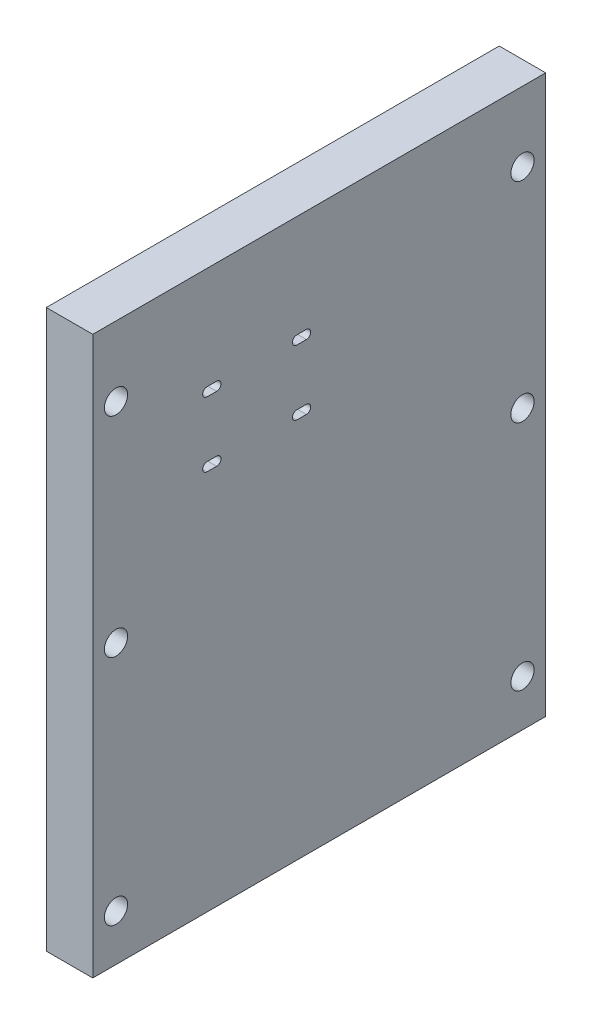
ISO-10303-21;
HEADER;
FILE_DESCRIPTION(('STEP AP214'),'2;1');
FILE_NAME('part.step','',(''),(''),'','','');
FILE_SCHEMA(('AUTOMOTIVE_DESIGN { 1 0 10303 214 1 1 1 1 }'));
ENDSEC;
DATA;
#1=APPLICATION_CONTEXT('core data for automotive mechanical design processes');
#2=APPLICATION_PROTOCOL_DEFINITION('international standard','automotive_design',2000,#1);
#3=PRODUCT_CONTEXT('',#1,'mechanical');
#4=PRODUCT('Part','Part','',(#3));
#5=PRODUCT_RELATED_PRODUCT_CATEGORY('part','',(#4));
#6=PRODUCT_DEFINITION_FORMATION('','',#4);
#7=PRODUCT_DEFINITION_CONTEXT('part definition',#1,'design');
#8=PRODUCT_DEFINITION('design','',#6,#7);
#9=PRODUCT_DEFINITION_SHAPE('','',#8);
#10=(LENGTH_UNIT() NAMED_UNIT(*) SI_UNIT(.MILLI.,.METRE.));
#11=(NAMED_UNIT(*) PLANE_ANGLE_UNIT() SI_UNIT($,.RADIAN.));
#12=(NAMED_UNIT(*) SI_UNIT($,.STERADIAN.) SOLID_ANGLE_UNIT());
#13=UNCERTAINTY_MEASURE_WITH_UNIT(LENGTH_MEASURE(1.E-05),#10,'distance_accuracy_value','');
#14=(GEOMETRIC_REPRESENTATION_CONTEXT(3) GLOBAL_UNCERTAINTY_ASSIGNED_CONTEXT((#13)) GLOBAL_UNIT_ASSIGNED_CONTEXT((#10,
#11,#12)) REPRESENTATION_CONTEXT('',''));
#15=CARTESIAN_POINT('',(0.,0.,0.));
#16=DIRECTION('',(0.,0.,1.));
#17=DIRECTION('',(1.,0.,0.));
#18=AXIS2_PLACEMENT_3D('',#15,#16,#17);
#19=CARTESIAN_POINT('',(12.7,46.97,-33.570324851537));
#20=DIRECTION('',(-1.,0.,0.));
#21=DIRECTION('',(0.,0.,1.));
#22=AXIS2_PLACEMENT_3D('',#19,#20,#21);
#23=CYLINDRICAL_SURFACE('',#22,1.2);
#24=CARTESIAN_POINT('',(0.,46.97,-33.570324851537));
#25=DIRECTION('',(1.,0.,0.));
#26=DIRECTION('',(0.,0.,-1.));
#27=AXIS2_PLACEMENT_3D('',#24,#25,#26);
#28=CIRCLE('',#27,1.2);
#29=CARTESIAN_POINT('',(0.,48.17,-33.570324851537));
#30=VERTEX_POINT('',#29);
#31=CARTESIAN_POINT('',(0.,45.77,-33.570324851537));
#32=VERTEX_POINT('',#31);
#33=EDGE_CURVE('E348',#30,#32,#28,.T.);
#34=ORIENTED_EDGE('',*,*,#33,.F.);
#35=DIRECTION('',(-1.,0.,0.));
#36=VECTOR('',#35,1.);
#37=CARTESIAN_POINT('',(12.7,48.17,-33.570324851537));
#38=LINE('',#37,#36);
#39=CARTESIAN_POINT('',(12.7,48.17,-33.570324851537));
#40=VERTEX_POINT('',#39);
#41=EDGE_CURVE('E11',#40,#30,#38,.T.);
#42=ORIENTED_EDGE('',*,*,#41,.F.);
#43=CARTESIAN_POINT('',(12.7,46.97,-33.570324851537));
#44=DIRECTION('',(1.,0.,0.));
#45=DIRECTION('',(0.,0.,-1.));
#46=AXIS2_PLACEMENT_3D('',#43,#44,#45);
#47=CIRCLE('',#46,1.2);
#48=CARTESIAN_POINT('',(12.7,45.77,-33.570324851537));
#49=VERTEX_POINT('',#48);
#50=EDGE_CURVE('E251',#40,#49,#47,.T.);
#51=ORIENTED_EDGE('',*,*,#50,.T.);
#52=DIRECTION('',(-1.,0.,0.));
#53=VECTOR('',#52,1.);
#54=CARTESIAN_POINT('',(12.7,45.77,-33.570324851537));
#55=LINE('',#54,#53);
#56=EDGE_CURVE('E161',#49,#32,#55,.T.);
#57=ORIENTED_EDGE('',*,*,#56,.T.);
#58=EDGE_LOOP('',(#34,#42,#51,#57));
#59=FACE_BOUND('',#58,.T.);
#60=ADVANCED_FACE('F51',(#59),#23,.F.);
#61=CARTESIAN_POINT('',(12.7,48.17,0.));
#62=DIRECTION('',(0.,-1.,0.));
#63=DIRECTION('',(0.,0.,-1.));
#64=AXIS2_PLACEMENT_3D('',#61,#62,#63);
#65=PLANE('',#64);
#66=DIRECTION('',(0.,0.,1.));
#67=VECTOR('',#66,1.);
#68=CARTESIAN_POINT('',(0.,48.17,0.));
#69=LINE('',#68,#67);
#70=CARTESIAN_POINT('',(0.,48.17,-36.170324851537));
#71=VERTEX_POINT('',#70);
#72=EDGE_CURVE('E242',#71,#30,#69,.T.);
#73=ORIENTED_EDGE('',*,*,#72,.F.);
#74=DIRECTION('',(-1.,0.,0.));
#75=VECTOR('',#74,1.);
#76=CARTESIAN_POINT('',(12.7,48.17,-36.170324851537));
#77=LINE('',#76,#75);
#78=CARTESIAN_POINT('',(12.7,48.17,-36.170324851537));
#79=VERTEX_POINT('',#78);
#80=EDGE_CURVE('E62',#79,#71,#77,.T.);
#81=ORIENTED_EDGE('',*,*,#80,.F.);
#82=DIRECTION('',(0.,0.,1.));
#83=VECTOR('',#82,1.);
#84=CARTESIAN_POINT('',(12.7,48.17,0.));
#85=LINE('',#84,#83);
#86=EDGE_CURVE('E240',#79,#40,#85,.T.);
#87=ORIENTED_EDGE('',*,*,#86,.T.);
#88=ORIENTED_EDGE('',*,*,#41,.T.);
#89=EDGE_LOOP('',(#73,#81,#87,#88));
#90=FACE_BOUND('',#89,.T.);
#91=ADVANCED_FACE('F239',(#90),#65,.T.);
#92=CARTESIAN_POINT('',(12.7,46.97,-36.170324851537));
#93=DIRECTION('',(-1.,0.,0.));
#94=DIRECTION('',(0.,0.,1.));
#95=AXIS2_PLACEMENT_3D('',#92,#93,#94);
#96=CYLINDRICAL_SURFACE('',#95,1.2);
#97=CARTESIAN_POINT('',(0.,46.97,-36.170324851537));
#98=DIRECTION('',(1.,0.,0.));
#99=DIRECTION('',(0.,0.,-1.));
#100=AXIS2_PLACEMENT_3D('',#97,#98,#99);
#101=CIRCLE('',#100,1.2);
#102=CARTESIAN_POINT('',(0.,45.77,-36.170324851537));
#103=VERTEX_POINT('',#102);
#104=EDGE_CURVE('E354',#103,#71,#101,.T.);
#105=ORIENTED_EDGE('',*,*,#104,.F.);
#106=DIRECTION('',(-1.,0.,0.));
#107=VECTOR('',#106,1.);
#108=CARTESIAN_POINT('',(12.7,45.77,-36.170324851537));
#109=LINE('',#108,#107);
#110=CARTESIAN_POINT('',(12.7,45.77,-36.170324851537));
#111=VERTEX_POINT('',#110);
#112=EDGE_CURVE('E154',#111,#103,#109,.T.);
#113=ORIENTED_EDGE('',*,*,#112,.F.);
#114=CARTESIAN_POINT('',(12.7,46.97,-36.170324851537));
#115=DIRECTION('',(1.,0.,0.));
#116=DIRECTION('',(0.,0.,-1.));
#117=AXIS2_PLACEMENT_3D('',#114,#115,#116);
#118=CIRCLE('',#117,1.2);
#119=EDGE_CURVE('E250',#111,#79,#118,.T.);
#120=ORIENTED_EDGE('',*,*,#119,.T.);
#121=ORIENTED_EDGE('',*,*,#80,.T.);
#122=EDGE_LOOP('',(#105,#113,#120,#121));
#123=FACE_BOUND('',#122,.T.);
#124=ADVANCED_FACE('F254',(#123),#96,.F.);
#125=CARTESIAN_POINT('',(12.7,30.43,0.));
#126=DIRECTION('',(0.,-1.,0.));
#127=DIRECTION('',(0.,0.,-1.));
#128=AXIS2_PLACEMENT_3D('',#125,#126,#127);
#129=PLANE('',#128);
#130=DIRECTION('',(0.,0.,1.));
#131=VECTOR('',#130,1.);
#132=CARTESIAN_POINT('',(0.,30.43,0.));
#133=LINE('',#132,#131);
#134=CARTESIAN_POINT('',(0.,30.43,-36.170324851537));
#135=VERTEX_POINT('',#134);
#136=CARTESIAN_POINT('',(0.,30.43,-33.570324851537));
#137=VERTEX_POINT('',#136);
#138=EDGE_CURVE('E332',#135,#137,#133,.T.);
#139=ORIENTED_EDGE('',*,*,#138,.F.);
#140=DIRECTION('',(-1.,0.,0.));
#141=VECTOR('',#140,1.);
#142=CARTESIAN_POINT('',(12.7,30.43,-36.170324851537));
#143=LINE('',#142,#141);
#144=CARTESIAN_POINT('',(12.7,30.43,-36.170324851537));
#145=VERTEX_POINT('',#144);
#146=EDGE_CURVE('E363',#145,#135,#143,.T.);
#147=ORIENTED_EDGE('',*,*,#146,.F.);
#148=DIRECTION('',(0.,0.,1.));
#149=VECTOR('',#148,1.);
#150=CARTESIAN_POINT('',(12.7,30.43,0.));
#151=LINE('',#150,#149);
#152=CARTESIAN_POINT('',(12.7,30.43,-33.570324851537));
#153=VERTEX_POINT('',#152);
#154=EDGE_CURVE('E473',#145,#153,#151,.T.);
#155=ORIENTED_EDGE('',*,*,#154,.T.);
#156=DIRECTION('',(-1.,0.,0.));
#157=VECTOR('',#156,1.);
#158=CARTESIAN_POINT('',(12.7,30.43,-33.570324851537));
#159=LINE('',#158,#157);
#160=EDGE_CURVE('E366',#153,#137,#159,.T.);
#161=ORIENTED_EDGE('',*,*,#160,.T.);
#162=EDGE_LOOP('',(#139,#147,#155,#161));
#163=FACE_BOUND('',#162,.T.);
#164=ADVANCED_FACE('F522',(#163),#129,.T.);
#165=CARTESIAN_POINT('',(12.7,29.23,-36.170324851537));
#166=DIRECTION('',(-1.,0.,0.));
#167=DIRECTION('',(0.,0.,1.));
#168=AXIS2_PLACEMENT_3D('',#165,#166,#167);
#169=CYLINDRICAL_SURFACE('',#168,1.2);
#170=CARTESIAN_POINT('',(0.,29.23,-36.170324851537));
#171=DIRECTION('',(1.,0.,0.));
#172=DIRECTION('',(0.,0.,-1.));
#173=AXIS2_PLACEMENT_3D('',#170,#171,#172);
#174=CIRCLE('',#173,1.2);
#175=CARTESIAN_POINT('',(0.,28.03,-36.170324851537));
#176=VERTEX_POINT('',#175);
#177=EDGE_CURVE('E336',#135,#176,#174,.F.);
#178=ORIENTED_EDGE('',*,*,#177,.T.);
#179=DIRECTION('',(-1.,0.,0.));
#180=VECTOR('',#179,1.);
#181=CARTESIAN_POINT('',(12.7,28.03,-36.170324851537));
#182=LINE('',#181,#180);
#183=CARTESIAN_POINT('',(12.7,28.03,-36.170324851537));
#184=VERTEX_POINT('',#183);
#185=EDGE_CURVE('E374',#184,#176,#182,.T.);
#186=ORIENTED_EDGE('',*,*,#185,.F.);
#187=CARTESIAN_POINT('',(12.7,29.23,-36.170324851537));
#188=DIRECTION('',(1.,0.,0.));
#189=DIRECTION('',(0.,0.,-1.));
#190=AXIS2_PLACEMENT_3D('',#187,#188,#189);
#191=CIRCLE('',#190,1.2);
#192=EDGE_CURVE('E477',#145,#184,#191,.F.);
#193=ORIENTED_EDGE('',*,*,#192,.F.);
#194=ORIENTED_EDGE('',*,*,#146,.T.);
#195=EDGE_LOOP('',(#178,#186,#193,#194));
#196=FACE_BOUND('',#195,.T.);
#197=ADVANCED_FACE('F518',(#196),#169,.F.);
#198=CARTESIAN_POINT('',(12.7,28.03,0.));
#199=DIRECTION('',(0.,-1.,0.));
#200=DIRECTION('',(0.,0.,-1.));
#201=AXIS2_PLACEMENT_3D('',#198,#199,#200);
#202=PLANE('',#201);
#203=DIRECTION('',(0.,0.,1.));
#204=VECTOR('',#203,1.);
#205=CARTESIAN_POINT('',(0.,28.03,0.));
#206=LINE('',#205,#204);
#207=CARTESIAN_POINT('',(0.,28.03,-33.570324851537));
#208=VERTEX_POINT('',#207);
#209=EDGE_CURVE('E340',#176,#208,#206,.T.);
#210=ORIENTED_EDGE('',*,*,#209,.T.);
#211=DIRECTION('',(-1.,0.,0.));
#212=VECTOR('',#211,1.);
#213=CARTESIAN_POINT('',(12.7,28.03,-33.570324851537));
#214=LINE('',#213,#212);
#215=CARTESIAN_POINT('',(12.7,28.03,-33.570324851537));
#216=VERTEX_POINT('',#215);
#217=EDGE_CURVE('E369',#216,#208,#214,.T.);
#218=ORIENTED_EDGE('',*,*,#217,.F.);
#219=DIRECTION('',(0.,0.,1.));
#220=VECTOR('',#219,1.);
#221=CARTESIAN_POINT('',(12.7,28.03,0.));
#222=LINE('',#221,#220);
#223=EDGE_CURVE('E481',#184,#216,#222,.T.);
#224=ORIENTED_EDGE('',*,*,#223,.F.);
#225=ORIENTED_EDGE('',*,*,#185,.T.);
#226=EDGE_LOOP('',(#210,#218,#224,#225));
#227=FACE_BOUND('',#226,.T.);
#228=ADVANCED_FACE('F514',(#227),#202,.F.);
#229=CARTESIAN_POINT('',(12.7,45.77,0.));
#230=DIRECTION('',(0.,1.,0.));
#231=DIRECTION('',(0.,0.,1.));
#232=AXIS2_PLACEMENT_3D('',#229,#230,#231);
#233=PLANE('',#232);
#234=DIRECTION('',(0.,0.,-1.));
#235=VECTOR('',#234,1.);
#236=CARTESIAN_POINT('',(0.,45.77,0.));
#237=LINE('',#236,#235);
#238=CARTESIAN_POINT('',(0.,45.77,-9.03032485153705));
#239=VERTEX_POINT('',#238);
#240=CARTESIAN_POINT('',(0.,45.77,-11.6303248515371));
#241=VERTEX_POINT('',#240);
#242=EDGE_CURVE('E316',#239,#241,#237,.T.);
#243=ORIENTED_EDGE('',*,*,#242,.F.);
#244=DIRECTION('',(-1.,0.,0.));
#245=VECTOR('',#244,1.);
#246=CARTESIAN_POINT('',(12.7,45.77,-9.03032485153705));
#247=LINE('',#246,#245);
#248=CARTESIAN_POINT('',(12.7,45.77,-9.03032485153705));
#249=VERTEX_POINT('',#248);
#250=EDGE_CURVE('E370',#249,#239,#247,.T.);
#251=ORIENTED_EDGE('',*,*,#250,.F.);
#252=DIRECTION('',(0.,0.,-1.));
#253=VECTOR('',#252,1.);
#254=CARTESIAN_POINT('',(12.7,45.77,0.));
#255=LINE('',#254,#253);
#256=CARTESIAN_POINT('',(12.7,45.77,-11.6303248515371));
#257=VERTEX_POINT('',#256);
#258=EDGE_CURVE('E458',#249,#257,#255,.T.);
#259=ORIENTED_EDGE('',*,*,#258,.T.);
#260=DIRECTION('',(-1.,0.,0.));
#261=VECTOR('',#260,1.);
#262=CARTESIAN_POINT('',(12.7,45.77,-11.6303248515371));
#263=LINE('',#262,#261);
#264=EDGE_CURVE('E380',#257,#241,#263,.T.);
#265=ORIENTED_EDGE('',*,*,#264,.T.);
#266=EDGE_LOOP('',(#243,#251,#259,#265));
#267=FACE_BOUND('',#266,.T.);
#268=ADVANCED_FACE('F517',(#267),#233,.T.);
#269=CARTESIAN_POINT('',(12.7,46.97,-9.03032485153705));
#270=DIRECTION('',(-1.,0.,0.));
#271=DIRECTION('',(0.,0.,1.));
#272=AXIS2_PLACEMENT_3D('',#269,#270,#271);
#273=CYLINDRICAL_SURFACE('',#272,1.2);
#274=CARTESIAN_POINT('',(0.,46.97,-9.03032485153705));
#275=DIRECTION('',(1.,0.,0.));
#276=DIRECTION('',(0.,0.,-1.));
#277=AXIS2_PLACEMENT_3D('',#274,#275,#276);
#278=CIRCLE('',#277,1.2);
#279=CARTESIAN_POINT('',(0.,48.17,-9.03032485153705));
#280=VERTEX_POINT('',#279);
#281=EDGE_CURVE('E320',#239,#280,#278,.F.);
#282=ORIENTED_EDGE('',*,*,#281,.T.);
#283=DIRECTION('',(-1.,0.,0.));
#284=VECTOR('',#283,1.);
#285=CARTESIAN_POINT('',(12.7,48.17,-9.03032485153705));
#286=LINE('',#285,#284);
#287=CARTESIAN_POINT('',(12.7,48.17,-9.03032485153705));
#288=VERTEX_POINT('',#287);
#289=EDGE_CURVE('E388',#288,#280,#286,.T.);
#290=ORIENTED_EDGE('',*,*,#289,.F.);
#291=CARTESIAN_POINT('',(12.7,46.97,-9.03032485153705));
#292=DIRECTION('',(1.,0.,0.));
#293=DIRECTION('',(0.,0.,-1.));
#294=AXIS2_PLACEMENT_3D('',#291,#292,#293);
#295=CIRCLE('',#294,1.2);
#296=EDGE_CURVE('E462',#249,#288,#295,.F.);
#297=ORIENTED_EDGE('',*,*,#296,.F.);
#298=ORIENTED_EDGE('',*,*,#250,.T.);
#299=EDGE_LOOP('',(#282,#290,#297,#298));
#300=FACE_BOUND('',#299,.T.);
#301=ADVANCED_FACE('F534',(#300),#273,.F.);
#302=CARTESIAN_POINT('',(12.7,48.17,0.));
#303=DIRECTION('',(0.,1.,0.));
#304=DIRECTION('',(0.,0.,1.));
#305=AXIS2_PLACEMENT_3D('',#302,#303,#304);
#306=PLANE('',#305);
#307=DIRECTION('',(0.,0.,-1.));
#308=VECTOR('',#307,1.);
#309=CARTESIAN_POINT('',(0.,48.17,0.));
#310=LINE('',#309,#308);
#311=CARTESIAN_POINT('',(0.,48.17,-11.6303248515371));
#312=VERTEX_POINT('',#311);
#313=EDGE_CURVE('E324',#280,#312,#310,.T.);
#314=ORIENTED_EDGE('',*,*,#313,.T.);
#315=DIRECTION('',(-1.,0.,0.));
#316=VECTOR('',#315,1.);
#317=CARTESIAN_POINT('',(12.7,48.17,-11.6303248515371));
#318=LINE('',#317,#316);
#319=CARTESIAN_POINT('',(12.7,48.17,-11.6303248515371));
#320=VERTEX_POINT('',#319);
#321=EDGE_CURVE('E383',#320,#312,#318,.T.);
#322=ORIENTED_EDGE('',*,*,#321,.F.);
#323=DIRECTION('',(0.,0.,-1.));
#324=VECTOR('',#323,1.);
#325=CARTESIAN_POINT('',(12.7,48.17,0.));
#326=LINE('',#325,#324);
#327=EDGE_CURVE('E466',#288,#320,#326,.T.);
#328=ORIENTED_EDGE('',*,*,#327,.F.);
#329=ORIENTED_EDGE('',*,*,#289,.T.);
#330=EDGE_LOOP('',(#314,#322,#328,#329));
#331=FACE_BOUND('',#330,.T.);
#332=ADVANCED_FACE('F530',(#331),#306,.F.);
#333=CARTESIAN_POINT('',(12.7,29.23,-11.6303248515371));
#334=DIRECTION('',(-1.,0.,0.));
#335=DIRECTION('',(0.,0.,1.));
#336=AXIS2_PLACEMENT_3D('',#333,#334,#335);
#337=CYLINDRICAL_SURFACE('',#336,1.2);
#338=CARTESIAN_POINT('',(0.,29.23,-11.6303248515371));
#339=DIRECTION('',(1.,0.,0.));
#340=DIRECTION('',(0.,0.,-1.));
#341=AXIS2_PLACEMENT_3D('',#338,#339,#340);
#342=CIRCLE('',#341,1.2);
#343=CARTESIAN_POINT('',(0.,28.03,-11.6303248515371));
#344=VERTEX_POINT('',#343);
#345=CARTESIAN_POINT('',(0.,30.43,-11.6303248515371));
#346=VERTEX_POINT('',#345);
#347=EDGE_CURVE('E300',#344,#346,#342,.T.);
#348=ORIENTED_EDGE('',*,*,#347,.F.);
#349=DIRECTION('',(-1.,0.,0.));
#350=VECTOR('',#349,1.);
#351=CARTESIAN_POINT('',(12.7,28.03,-11.6303248515371));
#352=LINE('',#351,#350);
#353=CARTESIAN_POINT('',(12.7,28.03,-11.6303248515371));
#354=VERTEX_POINT('',#353);
#355=EDGE_CURVE('E384',#354,#344,#352,.T.);
#356=ORIENTED_EDGE('',*,*,#355,.F.);
#357=CARTESIAN_POINT('',(12.7,29.23,-11.6303248515371));
#358=DIRECTION('',(1.,0.,0.));
#359=DIRECTION('',(0.,0.,-1.));
#360=AXIS2_PLACEMENT_3D('',#357,#358,#359);
#361=CIRCLE('',#360,1.2);
#362=CARTESIAN_POINT('',(12.7,30.43,-11.6303248515371));
#363=VERTEX_POINT('',#362);
#364=EDGE_CURVE('E437',#354,#363,#361,.T.);
#365=ORIENTED_EDGE('',*,*,#364,.T.);
#366=DIRECTION('',(-1.,0.,0.));
#367=VECTOR('',#366,1.);
#368=CARTESIAN_POINT('',(12.7,30.43,-11.6303248515371));
#369=LINE('',#368,#367);
#370=EDGE_CURVE('E394',#363,#346,#369,.T.);
#371=ORIENTED_EDGE('',*,*,#370,.T.);
#372=EDGE_LOOP('',(#348,#356,#365,#371));
#373=FACE_BOUND('',#372,.T.);
#374=ADVANCED_FACE('F533',(#373),#337,.F.);
#375=CARTESIAN_POINT('',(12.7,28.03,0.));
#376=DIRECTION('',(0.,1.,0.));
#377=DIRECTION('',(0.,0.,1.));
#378=AXIS2_PLACEMENT_3D('',#375,#376,#377);
#379=PLANE('',#378);
#380=DIRECTION('',(0.,0.,-1.));
#381=VECTOR('',#380,1.);
#382=CARTESIAN_POINT('',(0.,28.03,0.));
#383=LINE('',#382,#381);
#384=CARTESIAN_POINT('',(0.,28.03,-9.03032485153705));
#385=VERTEX_POINT('',#384);
#386=EDGE_CURVE('E304',#385,#344,#383,.T.);
#387=ORIENTED_EDGE('',*,*,#386,.F.);
#388=DIRECTION('',(-1.,0.,0.));
#389=VECTOR('',#388,1.);
#390=CARTESIAN_POINT('',(12.7,28.03,-9.03032485153705));
#391=LINE('',#390,#389);
#392=CARTESIAN_POINT('',(12.7,28.03,-9.03032485153705));
#393=VERTEX_POINT('',#392);
#394=EDGE_CURVE('E400',#393,#385,#391,.T.);
#395=ORIENTED_EDGE('',*,*,#394,.F.);
#396=DIRECTION('',(0.,0.,-1.));
#397=VECTOR('',#396,1.);
#398=CARTESIAN_POINT('',(12.7,28.03,0.));
#399=LINE('',#398,#397);
#400=EDGE_CURVE('E443',#393,#354,#399,.T.);
#401=ORIENTED_EDGE('',*,*,#400,.T.);
#402=ORIENTED_EDGE('',*,*,#355,.T.);
#403=EDGE_LOOP('',(#387,#395,#401,#402));
#404=FACE_BOUND('',#403,.T.);
#405=ADVANCED_FACE('F548',(#404),#379,.T.);
#406=CARTESIAN_POINT('',(12.7,29.23,-9.03032485153705));
#407=DIRECTION('',(-1.,0.,0.));
#408=DIRECTION('',(0.,0.,1.));
#409=AXIS2_PLACEMENT_3D('',#406,#407,#408);
#410=CYLINDRICAL_SURFACE('',#409,1.2);
#411=CARTESIAN_POINT('',(0.,29.23,-9.03032485153705));
#412=DIRECTION('',(1.,0.,0.));
#413=DIRECTION('',(0.,0.,-1.));
#414=AXIS2_PLACEMENT_3D('',#411,#412,#413);
#415=CIRCLE('',#414,1.2);
#416=CARTESIAN_POINT('',(0.,30.43,-9.03032485153705));
#417=VERTEX_POINT('',#416);
#418=EDGE_CURVE('E308',#417,#385,#415,.T.);
#419=ORIENTED_EDGE('',*,*,#418,.F.);
#420=DIRECTION('',(-1.,0.,0.));
#421=VECTOR('',#420,1.);
#422=CARTESIAN_POINT('',(12.7,30.43,-9.03032485153705));
#423=LINE('',#422,#421);
#424=CARTESIAN_POINT('',(12.7,30.43,-9.03032485153705));
#425=VERTEX_POINT('',#424);
#426=EDGE_CURVE('E397',#425,#417,#423,.T.);
#427=ORIENTED_EDGE('',*,*,#426,.F.);
#428=CARTESIAN_POINT('',(12.7,29.23,-9.03032485153705));
#429=DIRECTION('',(1.,0.,0.));
#430=DIRECTION('',(0.,0.,-1.));
#431=AXIS2_PLACEMENT_3D('',#428,#429,#430);
#432=CIRCLE('',#431,1.2);
#433=EDGE_CURVE('E451',#425,#393,#432,.T.);
#434=ORIENTED_EDGE('',*,*,#433,.T.);
#435=ORIENTED_EDGE('',*,*,#394,.T.);
#436=EDGE_LOOP('',(#419,#427,#434,#435));
#437=FACE_BOUND('',#436,.T.);
#438=ADVANCED_FACE('F545',(#437),#410,.F.);
#439=CARTESIAN_POINT('',(12.7,0.,-101.6));
#440=DIRECTION('',(0.,0.,1.));
#441=DIRECTION('',(1.,0.,0.));
#442=AXIS2_PLACEMENT_3D('',#439,#440,#441);
#443=PLANE('',#442);
#444=DIRECTION('',(0.,1.,0.));
#445=VECTOR('',#444,1.);
#446=CARTESIAN_POINT('',(0.,0.,-101.6));
#447=LINE('',#446,#445);
#448=CARTESIAN_POINT('',(0.,-76.2,-101.6));
#449=VERTEX_POINT('',#448);
#450=CARTESIAN_POINT('',(0.,76.2,-101.6));
#451=VERTEX_POINT('',#450);
#452=EDGE_CURVE('E286',#449,#451,#447,.T.);
#453=ORIENTED_EDGE('',*,*,#452,.T.);
#454=DIRECTION('',(-1.,0.,0.));
#455=VECTOR('',#454,1.);
#456=CARTESIAN_POINT('',(12.7,76.2,-101.6));
#457=LINE('',#456,#455);
#458=CARTESIAN_POINT('',(12.7,76.2,-101.6));
#459=VERTEX_POINT('',#458);
#460=EDGE_CURVE('E55',#459,#451,#457,.T.);
#461=ORIENTED_EDGE('',*,*,#460,.F.);
#462=DIRECTION('',(0.,1.,0.));
#463=VECTOR('',#462,1.);
#464=CARTESIAN_POINT('',(12.7,0.,-101.6));
#465=LINE('',#464,#463);
#466=CARTESIAN_POINT('',(12.7,-76.2,-101.6));
#467=VERTEX_POINT('',#466);
#468=EDGE_CURVE('E171',#467,#459,#465,.T.);
#469=ORIENTED_EDGE('',*,*,#468,.F.);
#470=DIRECTION('',(-1.,0.,0.));
#471=VECTOR('',#470,1.);
#472=CARTESIAN_POINT('',(12.7,-76.2,-101.6));
#473=LINE('',#472,#471);
#474=EDGE_CURVE('E258',#467,#449,#473,.T.);
#475=ORIENTED_EDGE('',*,*,#474,.T.);
#476=EDGE_LOOP('',(#453,#461,#469,#475));
#477=FACE_BOUND('',#476,.T.);
#478=ADVANCED_FACE('F424',(#477),#443,.F.);
#479=CARTESIAN_POINT('',(12.7,76.2,0.));
#480=DIRECTION('',(0.,1.,0.));
#481=DIRECTION('',(0.,0.,1.));
#482=AXIS2_PLACEMENT_3D('',#479,#480,#481);
#483=PLANE('',#482);
#484=DIRECTION('',(0.,0.,-1.));
#485=VECTOR('',#484,1.);
#486=CARTESIAN_POINT('',(0.,76.2,0.));
#487=LINE('',#486,#485);
#488=CARTESIAN_POINT('',(0.,76.2,22.225));
#489=VERTEX_POINT('',#488);
#490=EDGE_CURVE('E290',#489,#451,#487,.T.);
#491=ORIENTED_EDGE('',*,*,#490,.F.);
#492=DIRECTION('',(-1.,0.,0.));
#493=VECTOR('',#492,1.);
#494=CARTESIAN_POINT('',(12.7,76.2,22.225));
#495=LINE('',#494,#493);
#496=CARTESIAN_POINT('',(12.7,76.2,22.225));
#497=VERTEX_POINT('',#496);
#498=EDGE_CURVE('E411',#497,#489,#495,.T.);
#499=ORIENTED_EDGE('',*,*,#498,.F.);
#500=DIRECTION('',(0.,0.,-1.));
#501=VECTOR('',#500,1.);
#502=CARTESIAN_POINT('',(12.7,76.2,0.));
#503=LINE('',#502,#501);
#504=EDGE_CURVE('E421',#497,#459,#503,.T.);
#505=ORIENTED_EDGE('',*,*,#504,.T.);
#506=ORIENTED_EDGE('',*,*,#460,.T.);
#507=EDGE_LOOP('',(#491,#499,#505,#506));
#508=FACE_BOUND('',#507,.T.);
#509=ADVANCED_FACE('F420',(#508),#483,.T.);
#510=CARTESIAN_POINT('',(12.7,0.,22.225));
#511=DIRECTION('',(0.,0.,-1.));
#512=DIRECTION('',(-1.,0.,0.));
#513=AXIS2_PLACEMENT_3D('',#510,#511,#512);
#514=PLANE('',#513);
#515=DIRECTION('',(0.,-1.,0.));
#516=VECTOR('',#515,1.);
#517=CARTESIAN_POINT('',(0.,0.,22.225));
#518=LINE('',#517,#516);
#519=CARTESIAN_POINT('',(0.,-76.2,22.225));
#520=VERTEX_POINT('',#519);
#521=EDGE_CURVE('E294',#489,#520,#518,.T.);
#522=ORIENTED_EDGE('',*,*,#521,.T.);
#523=DIRECTION('',(-1.,0.,0.));
#524=VECTOR('',#523,1.);
#525=CARTESIAN_POINT('',(12.7,-76.2,22.225));
#526=LINE('',#525,#524);
#527=CARTESIAN_POINT('',(12.7,-76.2,22.225));
#528=VERTEX_POINT('',#527);
#529=EDGE_CURVE('E408',#528,#520,#526,.T.);
#530=ORIENTED_EDGE('',*,*,#529,.F.);
#531=DIRECTION('',(0.,-1.,0.));
#532=VECTOR('',#531,1.);
#533=CARTESIAN_POINT('',(12.7,0.,22.225));
#534=LINE('',#533,#532);
#535=EDGE_CURVE('E438',#497,#528,#534,.T.);
#536=ORIENTED_EDGE('',*,*,#535,.F.);
#537=ORIENTED_EDGE('',*,*,#498,.T.);
#538=EDGE_LOOP('',(#522,#530,#536,#537));
#539=FACE_BOUND('',#538,.T.);
#540=ADVANCED_FACE('F431',(#539),#514,.F.);
#541=CARTESIAN_POINT('',(12.7,29.23,-33.570324851537));
#542=DIRECTION('',(-1.,0.,0.));
#543=DIRECTION('',(0.,0.,1.));
#544=AXIS2_PLACEMENT_3D('',#541,#542,#543);
#545=CYLINDRICAL_SURFACE('',#544,1.2);
#546=CARTESIAN_POINT('',(0.,29.23,-33.570324851537));
#547=DIRECTION('',(1.,0.,0.));
#548=DIRECTION('',(0.,0.,-1.));
#549=AXIS2_PLACEMENT_3D('',#546,#547,#548);
#550=CIRCLE('',#549,1.2);
#551=EDGE_CURVE('E344',#208,#137,#550,.F.);
#552=ORIENTED_EDGE('',*,*,#551,.T.);
#553=ORIENTED_EDGE('',*,*,#160,.F.);
#554=CARTESIAN_POINT('',(12.7,29.23,-33.570324851537));
#555=DIRECTION('',(1.,0.,0.));
#556=DIRECTION('',(0.,0.,-1.));
#557=AXIS2_PLACEMENT_3D('',#554,#555,#556);
#558=CIRCLE('',#557,1.2);
#559=EDGE_CURVE('E485',#216,#153,#558,.F.);
#560=ORIENTED_EDGE('',*,*,#559,.F.);
#561=ORIENTED_EDGE('',*,*,#217,.T.);
#562=EDGE_LOOP('',(#552,#553,#560,#561));
#563=FACE_BOUND('',#562,.T.);
#564=ADVANCED_FACE('F509',(#563),#545,.F.);
#565=CARTESIAN_POINT('',(12.7,46.97,-11.6303248515371));
#566=DIRECTION('',(-1.,0.,0.));
#567=DIRECTION('',(0.,0.,1.));
#568=AXIS2_PLACEMENT_3D('',#565,#566,#567);
#569=CYLINDRICAL_SURFACE('',#568,1.2);
#570=CARTESIAN_POINT('',(0.,46.97,-11.6303248515371));
#571=DIRECTION('',(1.,0.,0.));
#572=DIRECTION('',(0.,0.,-1.));
#573=AXIS2_PLACEMENT_3D('',#570,#571,#572);
#574=CIRCLE('',#573,1.2);
#575=EDGE_CURVE('E328',#312,#241,#574,.F.);
#576=ORIENTED_EDGE('',*,*,#575,.T.);
#577=ORIENTED_EDGE('',*,*,#264,.F.);
#578=CARTESIAN_POINT('',(12.7,46.97,-11.6303248515371));
#579=DIRECTION('',(1.,0.,0.));
#580=DIRECTION('',(0.,0.,-1.));
#581=AXIS2_PLACEMENT_3D('',#578,#579,#580);
#582=CIRCLE('',#581,1.2);
#583=EDGE_CURVE('E470',#320,#257,#582,.F.);
#584=ORIENTED_EDGE('',*,*,#583,.F.);
#585=ORIENTED_EDGE('',*,*,#321,.T.);
#586=EDGE_LOOP('',(#576,#577,#584,#585));
#587=FACE_BOUND('',#586,.T.);
#588=ADVANCED_FACE('F512',(#587),#569,.F.);
#589=CARTESIAN_POINT('',(12.7,30.43,0.));
#590=DIRECTION('',(0.,1.,0.));
#591=DIRECTION('',(0.,0.,1.));
#592=AXIS2_PLACEMENT_3D('',#589,#590,#591);
#593=PLANE('',#592);
#594=DIRECTION('',(0.,0.,-1.));
#595=VECTOR('',#594,1.);
#596=CARTESIAN_POINT('',(0.,30.43,0.));
#597=LINE('',#596,#595);
#598=EDGE_CURVE('E312',#417,#346,#597,.T.);
#599=ORIENTED_EDGE('',*,*,#598,.T.);
#600=ORIENTED_EDGE('',*,*,#370,.F.);
#601=DIRECTION('',(0.,0.,-1.));
#602=VECTOR('',#601,1.);
#603=CARTESIAN_POINT('',(12.7,30.43,0.));
#604=LINE('',#603,#602);
#605=EDGE_CURVE('E455',#425,#363,#604,.T.);
#606=ORIENTED_EDGE('',*,*,#605,.F.);
#607=ORIENTED_EDGE('',*,*,#426,.T.);
#608=EDGE_LOOP('',(#599,#600,#606,#607));
#609=FACE_BOUND('',#608,.T.);
#610=ADVANCED_FACE('F528',(#609),#593,.F.);
#611=CARTESIAN_POINT('',(12.7,-76.2,0.));
#612=DIRECTION('',(0.,1.,0.));
#613=DIRECTION('',(0.,0.,1.));
#614=AXIS2_PLACEMENT_3D('',#611,#612,#613);
#615=PLANE('',#614);
#616=DIRECTION('',(0.,0.,-1.));
#617=VECTOR('',#616,1.);
#618=CARTESIAN_POINT('',(0.,-76.2,0.));
#619=LINE('',#618,#617);
#620=EDGE_CURVE('E297',#520,#449,#619,.T.);
#621=ORIENTED_EDGE('',*,*,#620,.T.);
#622=ORIENTED_EDGE('',*,*,#474,.F.);
#623=DIRECTION('',(0.,0.,-1.));
#624=VECTOR('',#623,1.);
#625=CARTESIAN_POINT('',(12.7,-76.2,0.));
#626=LINE('',#625,#624);
#627=EDGE_CURVE('E435',#528,#467,#626,.T.);
#628=ORIENTED_EDGE('',*,*,#627,.F.);
#629=ORIENTED_EDGE('',*,*,#529,.T.);
#630=EDGE_LOOP('',(#621,#622,#628,#629));
#631=FACE_BOUND('',#630,.T.);
#632=ADVANCED_FACE('F434',(#631),#615,.F.);
#633=CARTESIAN_POINT('',(12.7,-63.5,15.875));
#634=DIRECTION('',(-1.,0.,0.));
#635=DIRECTION('',(0.,0.,1.));
#636=AXIS2_PLACEMENT_3D('',#633,#634,#635);
#637=CYLINDRICAL_SURFACE('',#636,3.175);
#638=CARTESIAN_POINT('',(12.7,-63.5,15.875));
#639=DIRECTION('',(1.,0.,0.));
#640=DIRECTION('',(0.,0.,-1.));
#641=AXIS2_PLACEMENT_3D('',#638,#639,#640);
#642=CIRCLE('',#641,3.175);
#643=CARTESIAN_POINT('',(12.7,-63.5,12.7));
#644=VERTEX_POINT('',#643);
#645=EDGE_CURVE('E858',#644,#644,#642,.T.);
#646=ORIENTED_EDGE('',*,*,#645,.T.);
#647=EDGE_LOOP('',(#646));
#648=FACE_BOUND('',#647,.T.);
#649=CARTESIAN_POINT('',(0.,-63.5,15.875));
#650=DIRECTION('',(1.,0.,0.));
#651=DIRECTION('',(0.,0.,-1.));
#652=AXIS2_PLACEMENT_3D('',#649,#650,#651);
#653=CIRCLE('',#652,3.175);
#654=CARTESIAN_POINT('',(0.,-63.5,12.7));
#655=VERTEX_POINT('',#654);
#656=EDGE_CURVE('E282',#655,#655,#653,.T.);
#657=ORIENTED_EDGE('',*,*,#656,.F.);
#658=EDGE_LOOP('',(#657));
#659=FACE_BOUND('',#658,.T.);
#660=ADVANCED_FACE('F558',(#648,#659),#637,.F.);
#661=CARTESIAN_POINT('',(12.7,-63.5,-95.25));
#662=DIRECTION('',(-1.,0.,0.));
#663=DIRECTION('',(0.,0.,1.));
#664=AXIS2_PLACEMENT_3D('',#661,#662,#663);
#665=CYLINDRICAL_SURFACE('',#664,3.175);
#666=CARTESIAN_POINT('',(12.7,-63.5,-95.25));
#667=DIRECTION('',(1.,0.,0.));
#668=DIRECTION('',(0.,0.,-1.));
#669=AXIS2_PLACEMENT_3D('',#666,#667,#668);
#670=CIRCLE('',#669,3.175);
#671=CARTESIAN_POINT('',(12.7,-63.5,-98.425));
#672=VERTEX_POINT('',#671);
#673=EDGE_CURVE('E854',#672,#672,#670,.T.);
#674=ORIENTED_EDGE('',*,*,#673,.T.);
#675=EDGE_LOOP('',(#674));
#676=FACE_BOUND('',#675,.T.);
#677=CARTESIAN_POINT('',(0.,-63.5,-95.25));
#678=DIRECTION('',(1.,0.,0.));
#679=DIRECTION('',(0.,0.,-1.));
#680=AXIS2_PLACEMENT_3D('',#677,#678,#679);
#681=CIRCLE('',#680,3.175);
#682=CARTESIAN_POINT('',(0.,-63.5,-98.425));
#683=VERTEX_POINT('',#682);
#684=EDGE_CURVE('E278',#683,#683,#681,.T.);
#685=ORIENTED_EDGE('',*,*,#684,.F.);
#686=EDGE_LOOP('',(#685));
#687=FACE_BOUND('',#686,.T.);
#688=ADVANCED_FACE('F567',(#676,#687),#665,.F.);
#689=CARTESIAN_POINT('',(12.7,0.,15.875));
#690=DIRECTION('',(-1.,0.,0.));
#691=DIRECTION('',(0.,0.,1.));
#692=AXIS2_PLACEMENT_3D('',#689,#690,#691);
#693=CYLINDRICAL_SURFACE('',#692,3.175);
#694=CARTESIAN_POINT('',(12.7,0.,15.875));
#695=DIRECTION('',(1.,0.,0.));
#696=DIRECTION('',(0.,0.,-1.));
#697=AXIS2_PLACEMENT_3D('',#694,#695,#696);
#698=CIRCLE('',#697,3.175);
#699=CARTESIAN_POINT('',(12.7,0.,12.7));
#700=VERTEX_POINT('',#699);
#701=EDGE_CURVE('E846',#700,#700,#698,.T.);
#702=ORIENTED_EDGE('',*,*,#701,.T.);
#703=EDGE_LOOP('',(#702));
#704=FACE_BOUND('',#703,.T.);
#705=CARTESIAN_POINT('',(0.,0.,15.875));
#706=DIRECTION('',(1.,0.,0.));
#707=DIRECTION('',(0.,0.,-1.));
#708=AXIS2_PLACEMENT_3D('',#705,#706,#707);
#709=CIRCLE('',#708,3.175);
#710=CARTESIAN_POINT('',(0.,0.,12.7));
#711=VERTEX_POINT('',#710);
#712=EDGE_CURVE('E274',#711,#711,#709,.T.);
#713=ORIENTED_EDGE('',*,*,#712,.F.);
#714=EDGE_LOOP('',(#713));
#715=FACE_BOUND('',#714,.T.);
#716=ADVANCED_FACE('F571',(#704,#715),#693,.F.);
#717=CARTESIAN_POINT('',(12.7,57.15,15.875));
#718=DIRECTION('',(-1.,0.,0.));
#719=DIRECTION('',(0.,0.,1.));
#720=AXIS2_PLACEMENT_3D('',#717,#718,#719);
#721=CYLINDRICAL_SURFACE('',#720,3.175);
#722=CARTESIAN_POINT('',(12.7,57.15,15.875));
#723=DIRECTION('',(1.,0.,0.));
#724=DIRECTION('',(0.,0.,-1.));
#725=AXIS2_PLACEMENT_3D('',#722,#723,#724);
#726=CIRCLE('',#725,3.175);
#727=CARTESIAN_POINT('',(12.7,57.15,12.7));
#728=VERTEX_POINT('',#727);
#729=EDGE_CURVE('E841',#728,#728,#726,.T.);
#730=ORIENTED_EDGE('',*,*,#729,.T.);
#731=EDGE_LOOP('',(#730));
#732=FACE_BOUND('',#731,.T.);
#733=CARTESIAN_POINT('',(0.,57.15,15.875));
#734=DIRECTION('',(1.,0.,0.));
#735=DIRECTION('',(0.,0.,-1.));
#736=AXIS2_PLACEMENT_3D('',#733,#734,#735);
#737=CIRCLE('',#736,3.175);
#738=CARTESIAN_POINT('',(0.,57.15,12.7));
#739=VERTEX_POINT('',#738);
#740=EDGE_CURVE('E270',#739,#739,#737,.T.);
#741=ORIENTED_EDGE('',*,*,#740,.F.);
#742=EDGE_LOOP('',(#741));
#743=FACE_BOUND('',#742,.T.);
#744=ADVANCED_FACE('F575',(#732,#743),#721,.F.);
#745=CARTESIAN_POINT('',(12.7,0.,-95.25));
#746=DIRECTION('',(-1.,0.,0.));
#747=DIRECTION('',(0.,0.,1.));
#748=AXIS2_PLACEMENT_3D('',#745,#746,#747);
#749=CYLINDRICAL_SURFACE('',#748,3.175);
#750=CARTESIAN_POINT('',(12.7,0.,-95.25));
#751=DIRECTION('',(1.,0.,0.));
#752=DIRECTION('',(0.,0.,-1.));
#753=AXIS2_PLACEMENT_3D('',#750,#751,#752);
#754=CIRCLE('',#753,3.175);
#755=CARTESIAN_POINT('',(12.7,0.,-98.425));
#756=VERTEX_POINT('',#755);
#757=EDGE_CURVE('E584',#756,#756,#754,.T.);
#758=ORIENTED_EDGE('',*,*,#757,.T.);
#759=EDGE_LOOP('',(#758));
#760=FACE_BOUND('',#759,.T.);
#761=CARTESIAN_POINT('',(0.,0.,-95.25));
#762=DIRECTION('',(1.,0.,0.));
#763=DIRECTION('',(0.,0.,-1.));
#764=AXIS2_PLACEMENT_3D('',#761,#762,#763);
#765=CIRCLE('',#764,3.175);
#766=CARTESIAN_POINT('',(0.,0.,-98.425));
#767=VERTEX_POINT('',#766);
#768=EDGE_CURVE('E266',#767,#767,#765,.T.);
#769=ORIENTED_EDGE('',*,*,#768,.F.);
#770=EDGE_LOOP('',(#769));
#771=FACE_BOUND('',#770,.T.);
#772=ADVANCED_FACE('F499',(#760,#771),#749,.F.);
#773=CARTESIAN_POINT('',(12.7,57.15,-95.25));
#774=DIRECTION('',(-1.,0.,0.));
#775=DIRECTION('',(0.,0.,1.));
#776=AXIS2_PLACEMENT_3D('',#773,#774,#775);
#777=CYLINDRICAL_SURFACE('',#776,3.175);
#778=CARTESIAN_POINT('',(12.7,57.15,-95.25));
#779=DIRECTION('',(1.,0.,0.));
#780=DIRECTION('',(0.,0.,-1.));
#781=AXIS2_PLACEMENT_3D('',#778,#779,#780);
#782=CIRCLE('',#781,3.175);
#783=CARTESIAN_POINT('',(12.7,57.15,-98.425));
#784=VERTEX_POINT('',#783);
#785=EDGE_CURVE('E360',#784,#784,#782,.T.);
#786=ORIENTED_EDGE('',*,*,#785,.T.);
#787=EDGE_LOOP('',(#786));
#788=FACE_BOUND('',#787,.T.);
#789=CARTESIAN_POINT('',(0.,57.15,-95.25));
#790=DIRECTION('',(1.,0.,0.));
#791=DIRECTION('',(0.,0.,-1.));
#792=AXIS2_PLACEMENT_3D('',#789,#790,#791);
#793=CIRCLE('',#792,3.175);
#794=CARTESIAN_POINT('',(0.,57.15,-98.425));
#795=VERTEX_POINT('',#794);
#796=EDGE_CURVE('E262',#795,#795,#793,.T.);
#797=ORIENTED_EDGE('',*,*,#796,.F.);
#798=EDGE_LOOP('',(#797));
#799=FACE_BOUND('',#798,.T.);
#800=ADVANCED_FACE('F53',(#788,#799),#777,.F.);
#801=CARTESIAN_POINT('',(12.7,45.77,0.));
#802=DIRECTION('',(0.,-1.,0.));
#803=DIRECTION('',(0.,0.,-1.));
#804=AXIS2_PLACEMENT_3D('',#801,#802,#803);
#805=PLANE('',#804);
#806=DIRECTION('',(0.,0.,1.));
#807=VECTOR('',#806,1.);
#808=CARTESIAN_POINT('',(0.,45.77,0.));
#809=LINE('',#808,#807);
#810=EDGE_CURVE('E357',#103,#32,#809,.T.);
#811=ORIENTED_EDGE('',*,*,#810,.T.);
#812=ORIENTED_EDGE('',*,*,#56,.F.);
#813=DIRECTION('',(0.,0.,1.));
#814=VECTOR('',#813,1.);
#815=CARTESIAN_POINT('',(12.7,45.77,0.));
#816=LINE('',#815,#814);
#817=EDGE_CURVE('E74',#111,#49,#816,.T.);
#818=ORIENTED_EDGE('',*,*,#817,.F.);
#819=ORIENTED_EDGE('',*,*,#112,.T.);
#820=EDGE_LOOP('',(#811,#812,#818,#819));
#821=FACE_BOUND('',#820,.T.);
#822=ADVANCED_FACE('F489',(#821),#805,.F.);
#823=CARTESIAN_POINT('',(12.7,0.,0.));
#824=DIRECTION('',(1.,0.,0.));
#825=DIRECTION('',(0.,0.,-1.));
#826=AXIS2_PLACEMENT_3D('',#823,#824,#825);
#827=PLANE('',#826);
#828=ORIENTED_EDGE('',*,*,#785,.F.);
#829=EDGE_LOOP('',(#828));
#830=FACE_BOUND('',#829,.T.);
#831=ORIENTED_EDGE('',*,*,#757,.F.);
#832=EDGE_LOOP('',(#831));
#833=FACE_BOUND('',#832,.T.);
#834=ORIENTED_EDGE('',*,*,#729,.F.);
#835=EDGE_LOOP('',(#834));
#836=FACE_BOUND('',#835,.T.);
#837=ORIENTED_EDGE('',*,*,#701,.F.);
#838=EDGE_LOOP('',(#837));
#839=FACE_BOUND('',#838,.T.);
#840=ORIENTED_EDGE('',*,*,#673,.F.);
#841=EDGE_LOOP('',(#840));
#842=FACE_BOUND('',#841,.T.);
#843=ORIENTED_EDGE('',*,*,#645,.F.);
#844=EDGE_LOOP('',(#843));
#845=FACE_BOUND('',#844,.T.);
#846=ORIENTED_EDGE('',*,*,#468,.T.);
#847=ORIENTED_EDGE('',*,*,#504,.F.);
#848=ORIENTED_EDGE('',*,*,#535,.T.);
#849=ORIENTED_EDGE('',*,*,#627,.T.);
#850=EDGE_LOOP('',(#846,#847,#848,#849));
#851=FACE_BOUND('',#850,.T.);
#852=ORIENTED_EDGE('',*,*,#364,.F.);
#853=ORIENTED_EDGE('',*,*,#400,.F.);
#854=ORIENTED_EDGE('',*,*,#433,.F.);
#855=ORIENTED_EDGE('',*,*,#605,.T.);
#856=EDGE_LOOP('',(#852,#853,#854,#855));
#857=FACE_BOUND('',#856,.T.);
#858=ORIENTED_EDGE('',*,*,#258,.F.);
#859=ORIENTED_EDGE('',*,*,#296,.T.);
#860=ORIENTED_EDGE('',*,*,#327,.T.);
#861=ORIENTED_EDGE('',*,*,#583,.T.);
#862=EDGE_LOOP('',(#858,#859,#860,#861));
#863=FACE_BOUND('',#862,.T.);
#864=ORIENTED_EDGE('',*,*,#154,.F.);
#865=ORIENTED_EDGE('',*,*,#192,.T.);
#866=ORIENTED_EDGE('',*,*,#223,.T.);
#867=ORIENTED_EDGE('',*,*,#559,.T.);
#868=EDGE_LOOP('',(#864,#865,#866,#867));
#869=FACE_BOUND('',#868,.T.);
#870=ORIENTED_EDGE('',*,*,#50,.F.);
#871=ORIENTED_EDGE('',*,*,#86,.F.);
#872=ORIENTED_EDGE('',*,*,#119,.F.);
#873=ORIENTED_EDGE('',*,*,#817,.T.);
#874=EDGE_LOOP('',(#870,#871,#872,#873));
#875=FACE_BOUND('',#874,.T.);
#876=ADVANCED_FACE('F249',(#830,#833,#836,#839,#842,#845,#851,#857,#863,#869,#875),#827,.T.);
#877=CARTESIAN_POINT('',(0.,0.,0.));
#878=DIRECTION('',(1.,0.,0.));
#879=DIRECTION('',(0.,0.,-1.));
#880=AXIS2_PLACEMENT_3D('',#877,#878,#879);
#881=PLANE('',#880);
#882=ORIENTED_EDGE('',*,*,#796,.T.);
#883=EDGE_LOOP('',(#882));
#884=FACE_BOUND('',#883,.T.);
#885=ORIENTED_EDGE('',*,*,#768,.T.);
#886=EDGE_LOOP('',(#885));
#887=FACE_BOUND('',#886,.T.);
#888=ORIENTED_EDGE('',*,*,#740,.T.);
#889=EDGE_LOOP('',(#888));
#890=FACE_BOUND('',#889,.T.);
#891=ORIENTED_EDGE('',*,*,#712,.T.);
#892=EDGE_LOOP('',(#891));
#893=FACE_BOUND('',#892,.T.);
#894=ORIENTED_EDGE('',*,*,#684,.T.);
#895=EDGE_LOOP('',(#894));
#896=FACE_BOUND('',#895,.T.);
#897=ORIENTED_EDGE('',*,*,#656,.T.);
#898=EDGE_LOOP('',(#897));
#899=FACE_BOUND('',#898,.T.);
#900=ORIENTED_EDGE('',*,*,#452,.F.);
#901=ORIENTED_EDGE('',*,*,#620,.F.);
#902=ORIENTED_EDGE('',*,*,#521,.F.);
#903=ORIENTED_EDGE('',*,*,#490,.T.);
#904=EDGE_LOOP('',(#900,#901,#902,#903));
#905=FACE_BOUND('',#904,.T.);
#906=ORIENTED_EDGE('',*,*,#347,.T.);
#907=ORIENTED_EDGE('',*,*,#598,.F.);
#908=ORIENTED_EDGE('',*,*,#418,.T.);
#909=ORIENTED_EDGE('',*,*,#386,.T.);
#910=EDGE_LOOP('',(#906,#907,#908,#909));
#911=FACE_BOUND('',#910,.T.);
#912=ORIENTED_EDGE('',*,*,#242,.T.);
#913=ORIENTED_EDGE('',*,*,#575,.F.);
#914=ORIENTED_EDGE('',*,*,#313,.F.);
#915=ORIENTED_EDGE('',*,*,#281,.F.);
#916=EDGE_LOOP('',(#912,#913,#914,#915));
#917=FACE_BOUND('',#916,.T.);
#918=ORIENTED_EDGE('',*,*,#138,.T.);
#919=ORIENTED_EDGE('',*,*,#551,.F.);
#920=ORIENTED_EDGE('',*,*,#209,.F.);
#921=ORIENTED_EDGE('',*,*,#177,.F.);
#922=EDGE_LOOP('',(#918,#919,#920,#921));
#923=FACE_BOUND('',#922,.T.);
#924=ORIENTED_EDGE('',*,*,#33,.T.);
#925=ORIENTED_EDGE('',*,*,#810,.F.);
#926=ORIENTED_EDGE('',*,*,#104,.T.);
#927=ORIENTED_EDGE('',*,*,#72,.T.);
#928=EDGE_LOOP('',(#924,#925,#926,#927));
#929=FACE_BOUND('',#928,.T.);
#930=ADVANCED_FACE('F428',(#884,#887,#890,#893,#896,#899,#905,#911,#917,#923,#929),#881,.F.);
#931=CLOSED_SHELL('',(#60,#91,#124,#164,#197,#228,#268,#301,#332,#374,#405,#438,#478,#509,#540,
#564,#588,#610,#632,#660,#688,#716,#744,#772,#800,#822,#876,#930));
#932=MANIFOLD_SOLID_BREP('B2',#931);
#933=ADVANCED_BREP_SHAPE_REPRESENTATION('',(#18,#932),#14);
#934=SHAPE_DEFINITION_REPRESENTATION(#9,#933);
ENDSEC;
END-ISO-10303-21;
